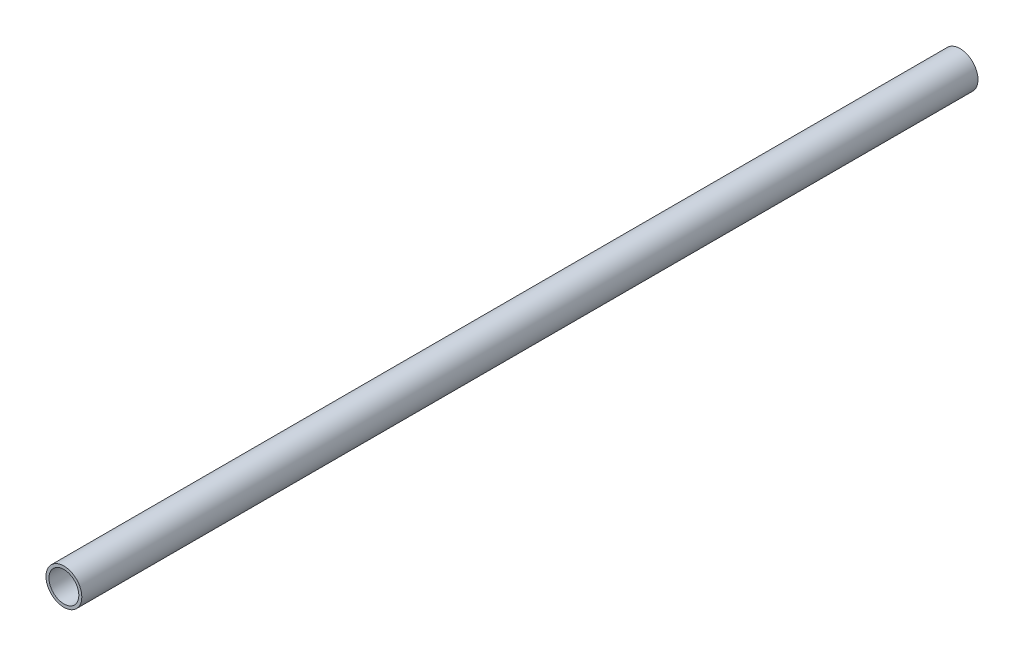
ISO-10303-21;
HEADER;
FILE_DESCRIPTION(('STEP AP214'),'2;1');
FILE_NAME('part.step','',(''),(''),'','','');
FILE_SCHEMA(('AUTOMOTIVE_DESIGN { 1 0 10303 214 1 1 1 1 }'));
ENDSEC;
DATA;
#1=APPLICATION_CONTEXT('core data for automotive mechanical design processes');
#2=APPLICATION_PROTOCOL_DEFINITION('international standard','automotive_design',2000,#1);
#3=PRODUCT_CONTEXT('',#1,'mechanical');
#4=PRODUCT('Part','Part','',(#3));
#5=PRODUCT_RELATED_PRODUCT_CATEGORY('part','',(#4));
#6=PRODUCT_DEFINITION_FORMATION('','',#4);
#7=PRODUCT_DEFINITION_CONTEXT('part definition',#1,'design');
#8=PRODUCT_DEFINITION('design','',#6,#7);
#9=PRODUCT_DEFINITION_SHAPE('','',#8);
#10=(LENGTH_UNIT() NAMED_UNIT(*) SI_UNIT(.MILLI.,.METRE.));
#11=(NAMED_UNIT(*) PLANE_ANGLE_UNIT() SI_UNIT($,.RADIAN.));
#12=(NAMED_UNIT(*) SI_UNIT($,.STERADIAN.) SOLID_ANGLE_UNIT());
#13=UNCERTAINTY_MEASURE_WITH_UNIT(LENGTH_MEASURE(1.E-05),#10,'distance_accuracy_value','');
#14=(GEOMETRIC_REPRESENTATION_CONTEXT(3) GLOBAL_UNCERTAINTY_ASSIGNED_CONTEXT((#13)) GLOBAL_UNIT_ASSIGNED_CONTEXT((#10,
#11,#12)) REPRESENTATION_CONTEXT('',''));
#15=CARTESIAN_POINT('',(0.,0.,0.));
#16=DIRECTION('',(0.,0.,1.));
#17=DIRECTION('',(1.,0.,0.));
#18=AXIS2_PLACEMENT_3D('',#15,#16,#17);
#19=CARTESIAN_POINT('',(0.,0.,300.));
#20=DIRECTION('',(0.,0.,1.));
#21=DIRECTION('',(1.,0.,0.));
#22=AXIS2_PLACEMENT_3D('',#19,#20,#21);
#23=PLANE('',#22);
#24=CARTESIAN_POINT('',(0.,0.,300.));
#25=DIRECTION('',(0.,0.,1.));
#26=DIRECTION('',(1.,0.,0.));
#27=AXIS2_PLACEMENT_3D('',#24,#25,#26);
#28=CIRCLE('',#27,6.);
#29=CARTESIAN_POINT('',(6.,0.,300.));
#30=VERTEX_POINT('',#29);
#31=EDGE_CURVE('E10',#30,#30,#28,.T.);
#32=ORIENTED_EDGE('',*,*,#31,.T.);
#33=EDGE_LOOP('',(#32));
#34=FACE_BOUND('',#33,.T.);
#35=CARTESIAN_POINT('',(0.,0.,300.));
#36=DIRECTION('',(0.,0.,1.));
#37=DIRECTION('',(1.,0.,0.));
#38=AXIS2_PLACEMENT_3D('',#35,#36,#37);
#39=CIRCLE('',#38,5.);
#40=CARTESIAN_POINT('',(5.,0.,300.));
#41=VERTEX_POINT('',#40);
#42=EDGE_CURVE('E43',#41,#41,#39,.T.);
#43=ORIENTED_EDGE('',*,*,#42,.F.);
#44=EDGE_LOOP('',(#43));
#45=FACE_BOUND('',#44,.T.);
#46=ADVANCED_FACE('F32',(#34,#45),#23,.T.);
#47=CARTESIAN_POINT('',(0.,0.,0.));
#48=DIRECTION('',(0.,0.,1.));
#49=DIRECTION('',(1.,0.,0.));
#50=AXIS2_PLACEMENT_3D('',#47,#48,#49);
#51=PLANE('',#50);
#52=CARTESIAN_POINT('',(0.,0.,0.));
#53=DIRECTION('',(0.,0.,1.));
#54=DIRECTION('',(1.,0.,0.));
#55=AXIS2_PLACEMENT_3D('',#52,#53,#54);
#56=CIRCLE('',#55,6.);
#57=CARTESIAN_POINT('',(6.,0.,0.));
#58=VERTEX_POINT('',#57);
#59=EDGE_CURVE('E36',#58,#58,#56,.T.);
#60=ORIENTED_EDGE('',*,*,#59,.F.);
#61=EDGE_LOOP('',(#60));
#62=FACE_BOUND('',#61,.T.);
#63=CARTESIAN_POINT('',(0.,0.,0.));
#64=DIRECTION('',(0.,0.,1.));
#65=DIRECTION('',(1.,0.,0.));
#66=AXIS2_PLACEMENT_3D('',#63,#64,#65);
#67=CIRCLE('',#66,5.);
#68=CARTESIAN_POINT('',(5.,0.,0.));
#69=VERTEX_POINT('',#68);
#70=EDGE_CURVE('E45',#69,#69,#67,.T.);
#71=ORIENTED_EDGE('',*,*,#70,.T.);
#72=EDGE_LOOP('',(#71));
#73=FACE_BOUND('',#72,.T.);
#74=ADVANCED_FACE('F55',(#62,#73),#51,.F.);
#75=CARTESIAN_POINT('',(0.,0.,300.));
#76=DIRECTION('',(0.,0.,-1.));
#77=DIRECTION('',(-1.,0.,0.));
#78=AXIS2_PLACEMENT_3D('',#75,#76,#77);
#79=CYLINDRICAL_SURFACE('',#78,6.);
#80=ORIENTED_EDGE('',*,*,#31,.F.);
#81=EDGE_LOOP('',(#80));
#82=FACE_BOUND('',#81,.T.);
#83=ORIENTED_EDGE('',*,*,#59,.T.);
#84=EDGE_LOOP('',(#83));
#85=FACE_BOUND('',#84,.T.);
#86=ADVANCED_FACE('F34',(#82,#85),#79,.T.);
#87=CARTESIAN_POINT('',(0.,0.,300.));
#88=DIRECTION('',(0.,0.,-1.));
#89=DIRECTION('',(-1.,0.,0.));
#90=AXIS2_PLACEMENT_3D('',#87,#88,#89);
#91=CYLINDRICAL_SURFACE('',#90,5.);
#92=ORIENTED_EDGE('',*,*,#42,.T.);
#93=EDGE_LOOP('',(#92));
#94=FACE_BOUND('',#93,.T.);
#95=ORIENTED_EDGE('',*,*,#70,.F.);
#96=EDGE_LOOP('',(#95));
#97=FACE_BOUND('',#96,.T.);
#98=ADVANCED_FACE('F51',(#94,#97),#91,.F.);
#99=CLOSED_SHELL('',(#46,#74,#86,#98));
#100=MANIFOLD_SOLID_BREP('B2',#99);
#101=ADVANCED_BREP_SHAPE_REPRESENTATION('',(#18,#100),#14);
#102=SHAPE_DEFINITION_REPRESENTATION(#9,#101);
ENDSEC;
END-ISO-10303-21;
